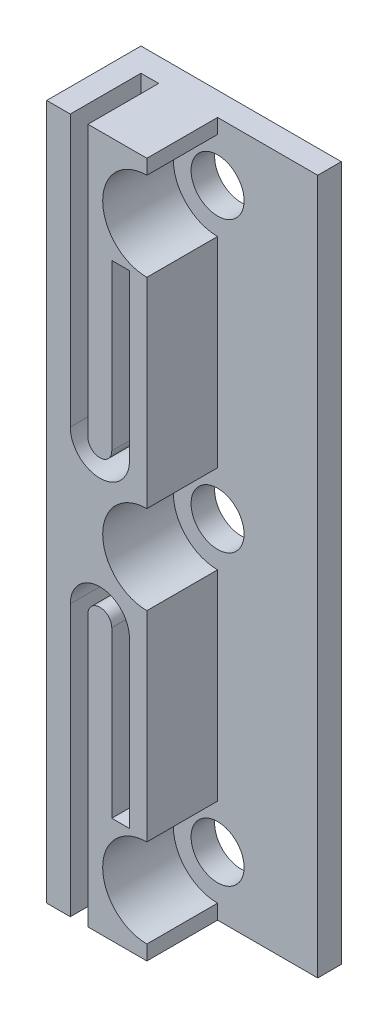
ISO-10303-21;
HEADER;
FILE_DESCRIPTION(('STEP AP214'),'2;1');
FILE_NAME('part.step','',(''),(''),'','','');
FILE_SCHEMA(('AUTOMOTIVE_DESIGN { 1 0 10303 214 1 1 1 1 }'));
ENDSEC;
DATA;
#1=APPLICATION_CONTEXT('core data for automotive mechanical design processes');
#2=APPLICATION_PROTOCOL_DEFINITION('international standard','automotive_design',2000,#1);
#3=PRODUCT_CONTEXT('',#1,'mechanical');
#4=PRODUCT('Part','Part','',(#3));
#5=PRODUCT_RELATED_PRODUCT_CATEGORY('part','',(#4));
#6=PRODUCT_DEFINITION_FORMATION('','',#4);
#7=PRODUCT_DEFINITION_CONTEXT('part definition',#1,'design');
#8=PRODUCT_DEFINITION('design','',#6,#7);
#9=PRODUCT_DEFINITION_SHAPE('','',#8);
#10=(LENGTH_UNIT() NAMED_UNIT(*) SI_UNIT(.MILLI.,.METRE.));
#11=(NAMED_UNIT(*) PLANE_ANGLE_UNIT() SI_UNIT($,.RADIAN.));
#12=(NAMED_UNIT(*) SI_UNIT($,.STERADIAN.) SOLID_ANGLE_UNIT());
#13=UNCERTAINTY_MEASURE_WITH_UNIT(LENGTH_MEASURE(1.E-05),#10,'distance_accuracy_value','');
#14=(GEOMETRIC_REPRESENTATION_CONTEXT(3) GLOBAL_UNCERTAINTY_ASSIGNED_CONTEXT((#13)) GLOBAL_UNIT_ASSIGNED_CONTEXT((#10,
#11,#12)) REPRESENTATION_CONTEXT('',''));
#15=CARTESIAN_POINT('',(0.,0.,0.));
#16=DIRECTION('',(0.,0.,1.));
#17=DIRECTION('',(1.,0.,0.));
#18=AXIS2_PLACEMENT_3D('',#15,#16,#17);
#19=CARTESIAN_POINT('',(8.50000000000001,-5.,-14.));
#20=DIRECTION('',(0.,0.,1.));
#21=DIRECTION('',(1.,0.,0.));
#22=AXIS2_PLACEMENT_3D('',#19,#20,#21);
#23=CYLINDRICAL_SURFACE('',#22,2.25);
#24=CARTESIAN_POINT('',(8.50000000000001,-5.,0.));
#25=DIRECTION('',(0.,0.,1.));
#26=DIRECTION('',(1.,0.,0.));
#27=AXIS2_PLACEMENT_3D('',#24,#25,#26);
#28=CIRCLE('',#27,2.25);
#29=CARTESIAN_POINT('',(10.75,-5.,0.));
#30=VERTEX_POINT('',#29);
#31=EDGE_CURVE('E391',#30,#30,#28,.T.);
#32=ORIENTED_EDGE('',*,*,#31,.F.);
#33=EDGE_LOOP('',(#32));
#34=FACE_BOUND('',#33,.T.);
#35=CARTESIAN_POINT('',(8.50000000000001,-5.,2.));
#36=DIRECTION('',(0.,0.,1.));
#37=DIRECTION('',(1.,0.,0.));
#38=AXIS2_PLACEMENT_3D('',#35,#36,#37);
#39=CIRCLE('',#38,2.25);
#40=CARTESIAN_POINT('',(10.75,-5.,2.));
#41=VERTEX_POINT('',#40);
#42=EDGE_CURVE('E394',#41,#41,#39,.T.);
#43=ORIENTED_EDGE('',*,*,#42,.T.);
#44=EDGE_LOOP('',(#43));
#45=FACE_BOUND('',#44,.T.);
#46=ADVANCED_FACE('F35',(#34,#45),#23,.F.);
#47=CARTESIAN_POINT('',(8.50000000000001,-54.,-14.));
#48=DIRECTION('',(0.,0.,1.));
#49=DIRECTION('',(1.,0.,0.));
#50=AXIS2_PLACEMENT_3D('',#47,#48,#49);
#51=CYLINDRICAL_SURFACE('',#50,2.25);
#52=CARTESIAN_POINT('',(8.50000000000001,-54.,0.));
#53=DIRECTION('',(0.,0.,1.));
#54=DIRECTION('',(1.,0.,0.));
#55=AXIS2_PLACEMENT_3D('',#52,#53,#54);
#56=CIRCLE('',#55,2.25);
#57=CARTESIAN_POINT('',(10.75,-54.,0.));
#58=VERTEX_POINT('',#57);
#59=EDGE_CURVE('E390',#58,#58,#56,.T.);
#60=ORIENTED_EDGE('',*,*,#59,.F.);
#61=EDGE_LOOP('',(#60));
#62=FACE_BOUND('',#61,.T.);
#63=CARTESIAN_POINT('',(8.50000000000001,-54.,2.));
#64=DIRECTION('',(0.,0.,1.));
#65=DIRECTION('',(1.,0.,0.));
#66=AXIS2_PLACEMENT_3D('',#63,#64,#65);
#67=CIRCLE('',#66,2.25);
#68=CARTESIAN_POINT('',(10.75,-54.,2.));
#69=VERTEX_POINT('',#68);
#70=EDGE_CURVE('E387',#69,#69,#67,.T.);
#71=ORIENTED_EDGE('',*,*,#70,.T.);
#72=EDGE_LOOP('',(#71));
#73=FACE_BOUND('',#72,.T.);
#74=ADVANCED_FACE('F474',(#62,#73),#51,.F.);
#75=CARTESIAN_POINT('',(8.5,-29.5,-14.));
#76=DIRECTION('',(0.,0.,1.));
#77=DIRECTION('',(1.,0.,0.));
#78=AXIS2_PLACEMENT_3D('',#75,#76,#77);
#79=CYLINDRICAL_SURFACE('',#78,2.25);
#80=CARTESIAN_POINT('',(8.5,-29.5,0.));
#81=DIRECTION('',(0.,0.,1.));
#82=DIRECTION('',(1.,0.,0.));
#83=AXIS2_PLACEMENT_3D('',#80,#81,#82);
#84=CIRCLE('',#83,2.25);
#85=CARTESIAN_POINT('',(10.75,-29.5,0.));
#86=VERTEX_POINT('',#85);
#87=EDGE_CURVE('E365',#86,#86,#84,.T.);
#88=ORIENTED_EDGE('',*,*,#87,.F.);
#89=EDGE_LOOP('',(#88));
#90=FACE_BOUND('',#89,.T.);
#91=CARTESIAN_POINT('',(8.5,-29.5,2.));
#92=DIRECTION('',(0.,0.,1.));
#93=DIRECTION('',(1.,0.,0.));
#94=AXIS2_PLACEMENT_3D('',#91,#92,#93);
#95=CIRCLE('',#94,2.25);
#96=CARTESIAN_POINT('',(10.75,-29.5,2.));
#97=VERTEX_POINT('',#96);
#98=EDGE_CURVE('E384',#97,#97,#95,.T.);
#99=ORIENTED_EDGE('',*,*,#98,.T.);
#100=EDGE_LOOP('',(#99));
#101=FACE_BOUND('',#100,.T.);
#102=ADVANCED_FACE('F477',(#90,#101),#79,.F.);
#103=CARTESIAN_POINT('',(8.50000000000001,0.,8.));
#104=DIRECTION('',(-1.,0.,0.));
#105=DIRECTION('',(0.,0.,1.));
#106=AXIS2_PLACEMENT_3D('',#103,#104,#105);
#107=PLANE('',#106);
#108=DIRECTION('',(0.,1.,0.));
#109=VECTOR('',#108,1.);
#110=CARTESIAN_POINT('',(8.50000000000001,0.,2.));
#111=LINE('',#110,#109);
#112=CARTESIAN_POINT('',(8.50000000000001,-59.,2.));
#113=VERTEX_POINT('',#112);
#114=CARTESIAN_POINT('',(8.50000000000001,-57.75,2.));
#115=VERTEX_POINT('',#114);
#116=EDGE_CURVE('E267',#113,#115,#111,.T.);
#117=ORIENTED_EDGE('',*,*,#116,.T.);
#118=DIRECTION('',(0.,0.,1.));
#119=VECTOR('',#118,1.);
#120=CARTESIAN_POINT('',(8.50000000000001,-57.75,2.));
#121=LINE('',#120,#119);
#122=CARTESIAN_POINT('',(8.50000000000001,-57.75,8.));
#123=VERTEX_POINT('',#122);
#124=EDGE_CURVE('E231',#115,#123,#121,.T.);
#125=ORIENTED_EDGE('',*,*,#124,.T.);
#126=DIRECTION('',(0.,1.,0.));
#127=VECTOR('',#126,1.);
#128=CARTESIAN_POINT('',(8.50000000000001,0.,8.));
#129=LINE('',#128,#127);
#130=CARTESIAN_POINT('',(8.50000000000001,-59.,8.));
#131=VERTEX_POINT('',#130);
#132=EDGE_CURVE('E242',#131,#123,#129,.T.);
#133=ORIENTED_EDGE('',*,*,#132,.F.);
#134=DIRECTION('',(0.,0.,-1.));
#135=VECTOR('',#134,1.);
#136=CARTESIAN_POINT('',(8.50000000000001,-59.,8.));
#137=LINE('',#136,#135);
#138=EDGE_CURVE('E434',#131,#113,#137,.T.);
#139=ORIENTED_EDGE('',*,*,#138,.T.);
#140=EDGE_LOOP('',(#117,#125,#133,#139));
#141=FACE_BOUND('',#140,.T.);
#142=ADVANCED_FACE('F432',(#141),#107,.F.);
#143=CARTESIAN_POINT('',(8.50000000000001,-25.75,2.));
#144=VERTEX_POINT('',#143);
#145=CARTESIAN_POINT('',(8.50000000000001,-8.75,2.));
#146=VERTEX_POINT('',#145);
#147=EDGE_CURVE('E420',#144,#146,#111,.T.);
#148=ORIENTED_EDGE('',*,*,#147,.T.);
#149=DIRECTION('',(0.,0.,1.));
#150=VECTOR('',#149,1.);
#151=CARTESIAN_POINT('',(8.50000000000001,-8.75,2.));
#152=LINE('',#151,#150);
#153=CARTESIAN_POINT('',(8.50000000000001,-8.75,8.));
#154=VERTEX_POINT('',#153);
#155=EDGE_CURVE('E232',#146,#154,#152,.T.);
#156=ORIENTED_EDGE('',*,*,#155,.T.);
#157=CARTESIAN_POINT('',(8.50000000000001,-25.75,8.));
#158=VERTEX_POINT('',#157);
#159=EDGE_CURVE('E248',#158,#154,#129,.T.);
#160=ORIENTED_EDGE('',*,*,#159,.F.);
#161=DIRECTION('',(0.,0.,1.));
#162=VECTOR('',#161,1.);
#163=CARTESIAN_POINT('',(8.50000000000001,-25.75,2.));
#164=LINE('',#163,#162);
#165=EDGE_CURVE('E397',#158,#144,#164,.F.);
#166=ORIENTED_EDGE('',*,*,#165,.T.);
#167=EDGE_LOOP('',(#148,#156,#160,#166));
#168=FACE_BOUND('',#167,.T.);
#169=ADVANCED_FACE('F424',(#168),#107,.F.);
#170=CARTESIAN_POINT('',(8.50000000000001,-50.25,8.));
#171=VERTEX_POINT('',#170);
#172=CARTESIAN_POINT('',(8.50000000000001,-33.25,8.));
#173=VERTEX_POINT('',#172);
#174=EDGE_CURVE('E239',#171,#173,#129,.T.);
#175=ORIENTED_EDGE('',*,*,#174,.F.);
#176=DIRECTION('',(0.,0.,1.));
#177=VECTOR('',#176,1.);
#178=CARTESIAN_POINT('',(8.50000000000001,-50.25,2.));
#179=LINE('',#178,#177);
#180=CARTESIAN_POINT('',(8.50000000000001,-50.25,2.));
#181=VERTEX_POINT('',#180);
#182=EDGE_CURVE('E221',#171,#181,#179,.F.);
#183=ORIENTED_EDGE('',*,*,#182,.T.);
#184=CARTESIAN_POINT('',(8.50000000000001,-33.25,2.));
#185=VERTEX_POINT('',#184);
#186=EDGE_CURVE('E426',#181,#185,#111,.T.);
#187=ORIENTED_EDGE('',*,*,#186,.T.);
#188=DIRECTION('',(0.,0.,1.));
#189=VECTOR('',#188,1.);
#190=CARTESIAN_POINT('',(8.50000000000001,-33.25,2.));
#191=LINE('',#190,#189);
#192=EDGE_CURVE('E247',#185,#173,#191,.T.);
#193=ORIENTED_EDGE('',*,*,#192,.T.);
#194=EDGE_LOOP('',(#175,#183,#187,#193));
#195=FACE_BOUND('',#194,.T.);
#196=ADVANCED_FACE('F245',(#195),#107,.F.);
#197=CARTESIAN_POINT('',(0.,0.,8.));
#198=DIRECTION('',(0.,0.,1.));
#199=DIRECTION('',(1.,0.,0.));
#200=AXIS2_PLACEMENT_3D('',#197,#198,#199);
#201=PLANE('',#200);
#202=CARTESIAN_POINT('',(8.50000000000001,-5.,8.));
#203=DIRECTION('',(0.,0.,1.));
#204=DIRECTION('',(1.,0.,0.));
#205=AXIS2_PLACEMENT_3D('',#202,#203,#204);
#206=CIRCLE('',#205,3.75);
#207=CARTESIAN_POINT('',(8.50000000000001,-1.25,8.));
#208=VERTEX_POINT('',#207);
#209=EDGE_CURVE('E411',#208,#154,#206,.T.);
#210=ORIENTED_EDGE('',*,*,#209,.F.);
#211=CARTESIAN_POINT('',(8.50000000000001,0.,8.));
#212=VERTEX_POINT('',#211);
#213=EDGE_CURVE('E250',#208,#212,#129,.T.);
#214=ORIENTED_EDGE('',*,*,#213,.T.);
#215=DIRECTION('',(-1.,0.,0.));
#216=VECTOR('',#215,1.);
#217=CARTESIAN_POINT('',(0.,0.,8.));
#218=LINE('',#217,#216);
#219=CARTESIAN_POINT('',(3.50000000000001,0.,8.));
#220=VERTEX_POINT('',#219);
#221=EDGE_CURVE('E593',#212,#220,#218,.T.);
#222=ORIENTED_EDGE('',*,*,#221,.T.);
#223=DIRECTION('',(0.,1.,0.));
#224=VECTOR('',#223,1.);
#225=CARTESIAN_POINT('',(3.50000000000001,0.,8.));
#226=LINE('',#225,#224);
#227=CARTESIAN_POINT('',(3.50000000000001,-23.,8.));
#228=VERTEX_POINT('',#227);
#229=EDGE_CURVE('E357',#228,#220,#226,.T.);
#230=ORIENTED_EDGE('',*,*,#229,.F.);
#231=CARTESIAN_POINT('',(4.5099627510071,-23.,8.));
#232=DIRECTION('',(0.,0.,1.));
#233=DIRECTION('',(1.,0.,0.));
#234=AXIS2_PLACEMENT_3D('',#231,#232,#233);
#235=CIRCLE('',#234,1.00996275100709);
#236=CARTESIAN_POINT('',(5.51992550201419,-23.,8.));
#237=VERTEX_POINT('',#236);
#238=EDGE_CURVE('E359',#228,#237,#235,.T.);
#239=ORIENTED_EDGE('',*,*,#238,.T.);
#240=DIRECTION('',(0.,1.,0.));
#241=VECTOR('',#240,1.);
#242=CARTESIAN_POINT('',(5.51992550201419,0.,8.));
#243=LINE('',#242,#241);
#244=CARTESIAN_POINT('',(5.51992550201419,-9.,8.));
#245=VERTEX_POINT('',#244);
#246=EDGE_CURVE('E362',#237,#245,#243,.T.);
#247=ORIENTED_EDGE('',*,*,#246,.T.);
#248=DIRECTION('',(1.,0.,0.));
#249=VECTOR('',#248,1.);
#250=CARTESIAN_POINT('',(0.,-9.,8.));
#251=LINE('',#250,#249);
#252=CARTESIAN_POINT('',(7.01992550201417,-9.,8.));
#253=VERTEX_POINT('',#252);
#254=EDGE_CURVE('E344',#245,#253,#251,.T.);
#255=ORIENTED_EDGE('',*,*,#254,.T.);
#256=DIRECTION('',(0.,1.,0.));
#257=VECTOR('',#256,1.);
#258=CARTESIAN_POINT('',(7.01992550201417,0.,8.));
#259=LINE('',#258,#257);
#260=CARTESIAN_POINT('',(7.01992550201418,-23.,8.));
#261=VERTEX_POINT('',#260);
#262=EDGE_CURVE('E348',#261,#253,#259,.T.);
#263=ORIENTED_EDGE('',*,*,#262,.F.);
#264=CARTESIAN_POINT('',(4.50996275100709,-23.,8.));
#265=DIRECTION('',(0.,0.,1.));
#266=DIRECTION('',(1.,0.,0.));
#267=AXIS2_PLACEMENT_3D('',#264,#265,#266);
#268=CIRCLE('',#267,2.50996275100709);
#269=CARTESIAN_POINT('',(2.00000000000001,-23.,8.));
#270=VERTEX_POINT('',#269);
#271=EDGE_CURVE('E351',#270,#261,#268,.T.);
#272=ORIENTED_EDGE('',*,*,#271,.F.);
#273=DIRECTION('',(0.,1.,0.));
#274=VECTOR('',#273,1.);
#275=CARTESIAN_POINT('',(2.00000000000001,0.,8.));
#276=LINE('',#275,#274);
#277=CARTESIAN_POINT('',(2.00000000000001,0.,8.));
#278=VERTEX_POINT('',#277);
#279=EDGE_CURVE('E354',#270,#278,#276,.T.);
#280=ORIENTED_EDGE('',*,*,#279,.T.);
#281=CARTESIAN_POINT('',(0.,0.,8.));
#282=VERTEX_POINT('',#281);
#283=EDGE_CURVE('E251',#278,#282,#218,.T.);
#284=ORIENTED_EDGE('',*,*,#283,.T.);
#285=DIRECTION('',(0.,-1.,0.));
#286=VECTOR('',#285,1.);
#287=CARTESIAN_POINT('',(0.,0.,8.));
#288=LINE('',#287,#286);
#289=CARTESIAN_POINT('',(0.,-59.,8.));
#290=VERTEX_POINT('',#289);
#291=EDGE_CURVE('E264',#282,#290,#288,.T.);
#292=ORIENTED_EDGE('',*,*,#291,.T.);
#293=DIRECTION('',(1.,0.,0.));
#294=VECTOR('',#293,1.);
#295=CARTESIAN_POINT('',(0.,-59.,8.));
#296=LINE('',#295,#294);
#297=CARTESIAN_POINT('',(2.00000000000001,-59.,8.));
#298=VERTEX_POINT('',#297);
#299=EDGE_CURVE('E255',#290,#298,#296,.T.);
#300=ORIENTED_EDGE('',*,*,#299,.T.);
#301=DIRECTION('',(0.,1.,0.));
#302=VECTOR('',#301,1.);
#303=CARTESIAN_POINT('',(2.00000000000001,0.,8.));
#304=LINE('',#303,#302);
#305=CARTESIAN_POINT('',(2.00000000000001,-36.,8.));
#306=VERTEX_POINT('',#305);
#307=EDGE_CURVE('E287',#298,#306,#304,.T.);
#308=ORIENTED_EDGE('',*,*,#307,.T.);
#309=CARTESIAN_POINT('',(4.5099627510071,-36.,8.));
#310=DIRECTION('',(0.,0.,1.));
#311=DIRECTION('',(1.,0.,0.));
#312=AXIS2_PLACEMENT_3D('',#309,#310,#311);
#313=CIRCLE('',#312,2.50996275100709);
#314=CARTESIAN_POINT('',(7.01992550201418,-36.,8.));
#315=VERTEX_POINT('',#314);
#316=EDGE_CURVE('E290',#306,#315,#313,.F.);
#317=ORIENTED_EDGE('',*,*,#316,.T.);
#318=DIRECTION('',(0.,1.,0.));
#319=VECTOR('',#318,1.);
#320=CARTESIAN_POINT('',(7.01992550201417,0.,8.));
#321=LINE('',#320,#319);
#322=CARTESIAN_POINT('',(7.01992550201419,-50.,8.));
#323=VERTEX_POINT('',#322);
#324=EDGE_CURVE('E293',#323,#315,#321,.T.);
#325=ORIENTED_EDGE('',*,*,#324,.F.);
#326=DIRECTION('',(1.,0.,0.));
#327=VECTOR('',#326,1.);
#328=CARTESIAN_POINT('',(0.,-50.,8.));
#329=LINE('',#328,#327);
#330=CARTESIAN_POINT('',(5.51992550201419,-50.,8.));
#331=VERTEX_POINT('',#330);
#332=EDGE_CURVE('E296',#331,#323,#329,.T.);
#333=ORIENTED_EDGE('',*,*,#332,.F.);
#334=DIRECTION('',(0.,1.,0.));
#335=VECTOR('',#334,1.);
#336=CARTESIAN_POINT('',(5.51992550201419,0.,8.));
#337=LINE('',#336,#335);
#338=CARTESIAN_POINT('',(5.51992550201419,-36.,8.));
#339=VERTEX_POINT('',#338);
#340=EDGE_CURVE('E299',#331,#339,#337,.T.);
#341=ORIENTED_EDGE('',*,*,#340,.T.);
#342=CARTESIAN_POINT('',(4.5099627510071,-36.,8.));
#343=DIRECTION('',(0.,0.,1.));
#344=DIRECTION('',(1.,0.,0.));
#345=AXIS2_PLACEMENT_3D('',#342,#343,#344);
#346=CIRCLE('',#345,1.00996275100709);
#347=CARTESIAN_POINT('',(3.50000000000001,-36.,8.));
#348=VERTEX_POINT('',#347);
#349=EDGE_CURVE('E302',#348,#339,#346,.F.);
#350=ORIENTED_EDGE('',*,*,#349,.F.);
#351=DIRECTION('',(0.,1.,0.));
#352=VECTOR('',#351,1.);
#353=CARTESIAN_POINT('',(3.50000000000001,0.,8.));
#354=LINE('',#353,#352);
#355=CARTESIAN_POINT('',(3.50000000000001,-59.,8.));
#356=VERTEX_POINT('',#355);
#357=EDGE_CURVE('E58',#356,#348,#354,.T.);
#358=ORIENTED_EDGE('',*,*,#357,.F.);
#359=EDGE_CURVE('E260',#356,#131,#296,.T.);
#360=ORIENTED_EDGE('',*,*,#359,.T.);
#361=ORIENTED_EDGE('',*,*,#132,.T.);
#362=CARTESIAN_POINT('',(8.50000000000001,-54.,8.));
#363=DIRECTION('',(0.,0.,1.));
#364=DIRECTION('',(1.,0.,0.));
#365=AXIS2_PLACEMENT_3D('',#362,#363,#364);
#366=CIRCLE('',#365,3.75);
#367=EDGE_CURVE('E224',#171,#123,#366,.T.);
#368=ORIENTED_EDGE('',*,*,#367,.F.);
#369=ORIENTED_EDGE('',*,*,#174,.T.);
#370=CARTESIAN_POINT('',(8.5,-29.5,8.));
#371=DIRECTION('',(0.,0.,1.));
#372=DIRECTION('',(1.,0.,0.));
#373=AXIS2_PLACEMENT_3D('',#370,#371,#372);
#374=CIRCLE('',#373,3.75);
#375=EDGE_CURVE('E402',#158,#173,#374,.T.);
#376=ORIENTED_EDGE('',*,*,#375,.F.);
#377=ORIENTED_EDGE('',*,*,#159,.T.);
#378=EDGE_LOOP('',(#210,#214,#222,#230,#239,#247,#255,#263,#272,#280,#284,#292,#300,#308,#317,
#325,#333,#341,#350,#358,#360,#361,#368,#369,#376,#377));
#379=FACE_BOUND('',#378,.T.);
#380=ADVANCED_FACE('F237',(#379),#201,.T.);
#381=CARTESIAN_POINT('',(0.,0.,2.));
#382=DIRECTION('',(0.,-1.,0.));
#383=DIRECTION('',(0.,0.,-1.));
#384=AXIS2_PLACEMENT_3D('',#381,#382,#383);
#385=PLANE('',#384);
#386=DIRECTION('',(0.,0.,1.));
#387=VECTOR('',#386,1.);
#388=CARTESIAN_POINT('',(2.00000000000001,0.,2.));
#389=LINE('',#388,#387);
#390=CARTESIAN_POINT('',(2.00000000000001,0.,2.));
#391=VERTEX_POINT('',#390);
#392=EDGE_CURVE('E334',#391,#278,#389,.T.);
#393=ORIENTED_EDGE('',*,*,#392,.F.);
#394=DIRECTION('',(-1.,0.,0.));
#395=VECTOR('',#394,1.);
#396=CARTESIAN_POINT('',(0.,0.,2.));
#397=LINE('',#396,#395);
#398=CARTESIAN_POINT('',(3.50000000000001,0.,2.));
#399=VERTEX_POINT('',#398);
#400=EDGE_CURVE('E375',#399,#391,#397,.T.);
#401=ORIENTED_EDGE('',*,*,#400,.F.);
#402=DIRECTION('',(0.,0.,1.));
#403=VECTOR('',#402,1.);
#404=CARTESIAN_POINT('',(3.50000000000001,0.,2.));
#405=LINE('',#404,#403);
#406=EDGE_CURVE('E331',#399,#220,#405,.T.);
#407=ORIENTED_EDGE('',*,*,#406,.T.);
#408=ORIENTED_EDGE('',*,*,#221,.F.);
#409=DIRECTION('',(0.,0.,-1.));
#410=VECTOR('',#409,1.);
#411=CARTESIAN_POINT('',(8.50000000000001,0.,8.));
#412=LINE('',#411,#410);
#413=CARTESIAN_POINT('',(8.50000000000001,0.,2.));
#414=VERTEX_POINT('',#413);
#415=EDGE_CURVE('E598',#212,#414,#412,.T.);
#416=ORIENTED_EDGE('',*,*,#415,.T.);
#417=DIRECTION('',(-1.,0.,0.));
#418=VECTOR('',#417,1.);
#419=CARTESIAN_POINT('',(0.,0.,2.));
#420=LINE('',#419,#418);
#421=CARTESIAN_POINT('',(17.,0.,2.));
#422=VERTEX_POINT('',#421);
#423=EDGE_CURVE('E447',#422,#414,#420,.T.);
#424=ORIENTED_EDGE('',*,*,#423,.F.);
#425=DIRECTION('',(0.,0.,-1.));
#426=VECTOR('',#425,1.);
#427=CARTESIAN_POINT('',(17.,0.,2.));
#428=LINE('',#427,#426);
#429=CARTESIAN_POINT('',(17.,0.,0.));
#430=VERTEX_POINT('',#429);
#431=EDGE_CURVE('E463',#422,#430,#428,.T.);
#432=ORIENTED_EDGE('',*,*,#431,.T.);
#433=DIRECTION('',(-1.,0.,0.));
#434=VECTOR('',#433,1.);
#435=CARTESIAN_POINT('',(0.,0.,0.));
#436=LINE('',#435,#434);
#437=CARTESIAN_POINT('',(0.,0.,0.));
#438=VERTEX_POINT('',#437);
#439=EDGE_CURVE('E445',#430,#438,#436,.T.);
#440=ORIENTED_EDGE('',*,*,#439,.T.);
#441=DIRECTION('',(0.,0.,-1.));
#442=VECTOR('',#441,1.);
#443=CARTESIAN_POINT('',(0.,0.,2.));
#444=LINE('',#443,#442);
#445=EDGE_CURVE('E454',#282,#438,#444,.T.);
#446=ORIENTED_EDGE('',*,*,#445,.F.);
#447=ORIENTED_EDGE('',*,*,#283,.F.);
#448=EDGE_LOOP('',(#393,#401,#407,#408,#416,#424,#432,#440,#446,#447));
#449=FACE_BOUND('',#448,.T.);
#450=ADVANCED_FACE('F564',(#449),#385,.F.);
#451=CARTESIAN_POINT('',(0.,0.,2.));
#452=DIRECTION('',(1.,0.,0.));
#453=DIRECTION('',(0.,1.,0.));
#454=AXIS2_PLACEMENT_3D('',#451,#452,#453);
#455=PLANE('',#454);
#456=DIRECTION('',(0.,-1.,0.));
#457=VECTOR('',#456,1.);
#458=CARTESIAN_POINT('',(0.,0.,0.));
#459=LINE('',#458,#457);
#460=CARTESIAN_POINT('',(0.,-59.,0.));
#461=VERTEX_POINT('',#460);
#462=EDGE_CURVE('E455',#438,#461,#459,.T.);
#463=ORIENTED_EDGE('',*,*,#462,.T.);
#464=DIRECTION('',(0.,0.,-1.));
#465=VECTOR('',#464,1.);
#466=CARTESIAN_POINT('',(0.,-59.,2.));
#467=LINE('',#466,#465);
#468=EDGE_CURVE('E43',#290,#461,#467,.T.);
#469=ORIENTED_EDGE('',*,*,#468,.F.);
#470=ORIENTED_EDGE('',*,*,#291,.F.);
#471=ORIENTED_EDGE('',*,*,#445,.T.);
#472=EDGE_LOOP('',(#463,#469,#470,#471));
#473=FACE_BOUND('',#472,.T.);
#474=ADVANCED_FACE('F37',(#473),#455,.F.);
#475=CARTESIAN_POINT('',(0.,-59.,2.));
#476=DIRECTION('',(0.,1.,0.));
#477=DIRECTION('',(0.,0.,1.));
#478=AXIS2_PLACEMENT_3D('',#475,#476,#477);
#479=PLANE('',#478);
#480=ORIENTED_EDGE('',*,*,#359,.F.);
#481=DIRECTION('',(0.,0.,1.));
#482=VECTOR('',#481,1.);
#483=CARTESIAN_POINT('',(3.50000000000001,-59.,2.));
#484=LINE('',#483,#482);
#485=CARTESIAN_POINT('',(3.50000000000001,-59.,2.));
#486=VERTEX_POINT('',#485);
#487=EDGE_CURVE('E284',#486,#356,#484,.T.);
#488=ORIENTED_EDGE('',*,*,#487,.F.);
#489=DIRECTION('',(1.,0.,0.));
#490=VECTOR('',#489,1.);
#491=CARTESIAN_POINT('',(0.,-59.,2.));
#492=LINE('',#491,#490);
#493=CARTESIAN_POINT('',(2.00000000000001,-59.,2.));
#494=VERTEX_POINT('',#493);
#495=EDGE_CURVE('E271',#494,#486,#492,.T.);
#496=ORIENTED_EDGE('',*,*,#495,.F.);
#497=DIRECTION('',(0.,0.,1.));
#498=VECTOR('',#497,1.);
#499=CARTESIAN_POINT('',(2.00000000000001,-59.,2.));
#500=LINE('',#499,#498);
#501=EDGE_CURVE('E281',#494,#298,#500,.T.);
#502=ORIENTED_EDGE('',*,*,#501,.T.);
#503=ORIENTED_EDGE('',*,*,#299,.F.);
#504=ORIENTED_EDGE('',*,*,#468,.T.);
#505=DIRECTION('',(1.,0.,0.));
#506=VECTOR('',#505,1.);
#507=CARTESIAN_POINT('',(0.,-59.,0.));
#508=LINE('',#507,#506);
#509=CARTESIAN_POINT('',(17.,-59.,0.));
#510=VERTEX_POINT('',#509);
#511=EDGE_CURVE('E458',#461,#510,#508,.T.);
#512=ORIENTED_EDGE('',*,*,#511,.T.);
#513=DIRECTION('',(0.,0.,-1.));
#514=VECTOR('',#513,1.);
#515=CARTESIAN_POINT('',(17.,-59.,2.));
#516=LINE('',#515,#514);
#517=CARTESIAN_POINT('',(17.,-59.,2.));
#518=VERTEX_POINT('',#517);
#519=EDGE_CURVE('E442',#518,#510,#516,.T.);
#520=ORIENTED_EDGE('',*,*,#519,.F.);
#521=DIRECTION('',(1.,0.,0.));
#522=VECTOR('',#521,1.);
#523=CARTESIAN_POINT('',(0.,-59.,2.));
#524=LINE('',#523,#522);
#525=EDGE_CURVE('E436',#113,#518,#524,.T.);
#526=ORIENTED_EDGE('',*,*,#525,.F.);
#527=ORIENTED_EDGE('',*,*,#138,.F.);
#528=EDGE_LOOP('',(#480,#488,#496,#502,#503,#504,#512,#520,#526,#527));
#529=FACE_BOUND('',#528,.T.);
#530=ADVANCED_FACE('F440',(#529),#479,.F.);
#531=CARTESIAN_POINT('',(17.,0.,2.));
#532=DIRECTION('',(-1.,0.,0.));
#533=DIRECTION('',(0.,-1.,0.));
#534=AXIS2_PLACEMENT_3D('',#531,#532,#533);
#535=PLANE('',#534);
#536=DIRECTION('',(0.,1.,0.));
#537=VECTOR('',#536,1.);
#538=CARTESIAN_POINT('',(17.,0.,0.));
#539=LINE('',#538,#537);
#540=EDGE_CURVE('E449',#510,#430,#539,.T.);
#541=ORIENTED_EDGE('',*,*,#540,.T.);
#542=ORIENTED_EDGE('',*,*,#431,.F.);
#543=DIRECTION('',(0.,1.,0.));
#544=VECTOR('',#543,1.);
#545=CARTESIAN_POINT('',(17.,0.,2.));
#546=LINE('',#545,#544);
#547=EDGE_CURVE('E444',#518,#422,#546,.T.);
#548=ORIENTED_EDGE('',*,*,#547,.F.);
#549=ORIENTED_EDGE('',*,*,#519,.T.);
#550=EDGE_LOOP('',(#541,#542,#548,#549));
#551=FACE_BOUND('',#550,.T.);
#552=ADVANCED_FACE('F483',(#551),#535,.F.);
#553=CARTESIAN_POINT('',(0.,0.,2.));
#554=DIRECTION('',(0.,0.,1.));
#555=DIRECTION('',(1.,0.,0.));
#556=AXIS2_PLACEMENT_3D('',#553,#554,#555);
#557=PLANE('',#556);
#558=ORIENTED_EDGE('',*,*,#70,.F.);
#559=EDGE_LOOP('',(#558));
#560=FACE_BOUND('',#559,.T.);
#561=ORIENTED_EDGE('',*,*,#42,.F.);
#562=EDGE_LOOP('',(#561));
#563=FACE_BOUND('',#562,.T.);
#564=CARTESIAN_POINT('',(8.50000000000001,-1.25,2.));
#565=VERTEX_POINT('',#564);
#566=EDGE_CURVE('E286',#565,#414,#111,.T.);
#567=ORIENTED_EDGE('',*,*,#566,.F.);
#568=CARTESIAN_POINT('',(8.50000000000001,-5.,2.));
#569=DIRECTION('',(0.,0.,1.));
#570=DIRECTION('',(1.,0.,0.));
#571=AXIS2_PLACEMENT_3D('',#568,#569,#570);
#572=CIRCLE('',#571,3.75);
#573=EDGE_CURVE('E408',#565,#146,#572,.T.);
#574=ORIENTED_EDGE('',*,*,#573,.T.);
#575=ORIENTED_EDGE('',*,*,#147,.F.);
#576=CARTESIAN_POINT('',(8.5,-29.5,2.));
#577=DIRECTION('',(0.,0.,1.));
#578=DIRECTION('',(1.,0.,0.));
#579=AXIS2_PLACEMENT_3D('',#576,#577,#578);
#580=CIRCLE('',#579,3.75);
#581=EDGE_CURVE('E401',#144,#185,#580,.T.);
#582=ORIENTED_EDGE('',*,*,#581,.T.);
#583=ORIENTED_EDGE('',*,*,#186,.F.);
#584=CARTESIAN_POINT('',(8.50000000000001,-54.,2.));
#585=DIRECTION('',(0.,0.,1.));
#586=DIRECTION('',(1.,0.,0.));
#587=AXIS2_PLACEMENT_3D('',#584,#585,#586);
#588=CIRCLE('',#587,3.75);
#589=EDGE_CURVE('E227',#181,#115,#588,.T.);
#590=ORIENTED_EDGE('',*,*,#589,.T.);
#591=ORIENTED_EDGE('',*,*,#116,.F.);
#592=ORIENTED_EDGE('',*,*,#525,.T.);
#593=ORIENTED_EDGE('',*,*,#547,.T.);
#594=ORIENTED_EDGE('',*,*,#423,.T.);
#595=EDGE_LOOP('',(#567,#574,#575,#582,#583,#590,#591,#592,#593,#594));
#596=FACE_BOUND('',#595,.T.);
#597=ORIENTED_EDGE('',*,*,#98,.F.);
#598=EDGE_LOOP('',(#597));
#599=FACE_BOUND('',#598,.T.);
#600=ADVANCED_FACE('F418',(#560,#563,#596,#599),#557,.T.);
#601=CARTESIAN_POINT('',(0.,0.,0.));
#602=DIRECTION('',(0.,0.,1.));
#603=DIRECTION('',(1.,0.,0.));
#604=AXIS2_PLACEMENT_3D('',#601,#602,#603);
#605=PLANE('',#604);
#606=ORIENTED_EDGE('',*,*,#59,.T.);
#607=EDGE_LOOP('',(#606));
#608=FACE_BOUND('',#607,.T.);
#609=ORIENTED_EDGE('',*,*,#31,.T.);
#610=EDGE_LOOP('',(#609));
#611=FACE_BOUND('',#610,.T.);
#612=ORIENTED_EDGE('',*,*,#87,.T.);
#613=EDGE_LOOP('',(#612));
#614=FACE_BOUND('',#613,.T.);
#615=ORIENTED_EDGE('',*,*,#462,.F.);
#616=ORIENTED_EDGE('',*,*,#439,.F.);
#617=ORIENTED_EDGE('',*,*,#540,.F.);
#618=ORIENTED_EDGE('',*,*,#511,.F.);
#619=EDGE_LOOP('',(#615,#616,#617,#618));
#620=FACE_BOUND('',#619,.T.);
#621=ADVANCED_FACE('F471',(#608,#611,#614,#620),#605,.F.);
#622=ORIENTED_EDGE('',*,*,#213,.F.);
#623=DIRECTION('',(0.,0.,1.));
#624=VECTOR('',#623,1.);
#625=CARTESIAN_POINT('',(8.50000000000001,-1.25,2.));
#626=LINE('',#625,#624);
#627=EDGE_CURVE('E11',#208,#565,#626,.F.);
#628=ORIENTED_EDGE('',*,*,#627,.T.);
#629=ORIENTED_EDGE('',*,*,#566,.T.);
#630=ORIENTED_EDGE('',*,*,#415,.F.);
#631=EDGE_LOOP('',(#622,#628,#629,#630));
#632=FACE_BOUND('',#631,.T.);
#633=ADVANCED_FACE('F561',(#632),#107,.F.);
#634=CARTESIAN_POINT('',(3.50000000000001,0.,2.));
#635=DIRECTION('',(1.,0.,0.));
#636=DIRECTION('',(0.,0.,-1.));
#637=AXIS2_PLACEMENT_3D('',#634,#635,#636);
#638=PLANE('',#637);
#639=ORIENTED_EDGE('',*,*,#357,.T.);
#640=DIRECTION('',(0.,0.,1.));
#641=VECTOR('',#640,1.);
#642=CARTESIAN_POINT('',(3.50000000000001,-36.,2.));
#643=LINE('',#642,#641);
#644=CARTESIAN_POINT('',(3.50000000000001,-36.,2.));
#645=VERTEX_POINT('',#644);
#646=EDGE_CURVE('E268',#645,#348,#643,.T.);
#647=ORIENTED_EDGE('',*,*,#646,.F.);
#648=DIRECTION('',(0.,1.,0.));
#649=VECTOR('',#648,1.);
#650=CARTESIAN_POINT('',(3.50000000000001,0.,2.));
#651=LINE('',#650,#649);
#652=EDGE_CURVE('E289',#486,#645,#651,.T.);
#653=ORIENTED_EDGE('',*,*,#652,.F.);
#654=ORIENTED_EDGE('',*,*,#487,.T.);
#655=EDGE_LOOP('',(#639,#647,#653,#654));
#656=FACE_BOUND('',#655,.T.);
#657=ADVANCED_FACE('F539',(#656),#638,.F.);
#658=CARTESIAN_POINT('',(2.00000000000001,0.,2.));
#659=DIRECTION('',(1.,0.,0.));
#660=DIRECTION('',(0.,0.,-1.));
#661=AXIS2_PLACEMENT_3D('',#658,#659,#660);
#662=PLANE('',#661);
#663=ORIENTED_EDGE('',*,*,#307,.F.);
#664=ORIENTED_EDGE('',*,*,#501,.F.);
#665=DIRECTION('',(0.,1.,0.));
#666=VECTOR('',#665,1.);
#667=CARTESIAN_POINT('',(2.00000000000001,0.,2.));
#668=LINE('',#667,#666);
#669=CARTESIAN_POINT('',(2.00000000000001,-36.,2.));
#670=VERTEX_POINT('',#669);
#671=EDGE_CURVE('E309',#494,#670,#668,.T.);
#672=ORIENTED_EDGE('',*,*,#671,.T.);
#673=DIRECTION('',(0.,0.,1.));
#674=VECTOR('',#673,1.);
#675=CARTESIAN_POINT('',(2.00000000000001,-36.,2.));
#676=LINE('',#675,#674);
#677=EDGE_CURVE('E279',#670,#306,#676,.T.);
#678=ORIENTED_EDGE('',*,*,#677,.T.);
#679=EDGE_LOOP('',(#663,#664,#672,#678));
#680=FACE_BOUND('',#679,.T.);
#681=ADVANCED_FACE('F535',(#680),#662,.T.);
#682=CARTESIAN_POINT('',(4.5099627510071,-36.,2.));
#683=DIRECTION('',(0.,0.,1.));
#684=DIRECTION('',(1.,0.,0.));
#685=AXIS2_PLACEMENT_3D('',#682,#683,#684);
#686=CYLINDRICAL_SURFACE('',#685,2.50996275100709);
#687=ORIENTED_EDGE('',*,*,#316,.F.);
#688=ORIENTED_EDGE('',*,*,#677,.F.);
#689=CARTESIAN_POINT('',(4.5099627510071,-36.,2.));
#690=DIRECTION('',(0.,0.,1.));
#691=DIRECTION('',(1.,0.,0.));
#692=AXIS2_PLACEMENT_3D('',#689,#690,#691);
#693=CIRCLE('',#692,2.50996275100709);
#694=CARTESIAN_POINT('',(7.01992550201418,-36.,2.));
#695=VERTEX_POINT('',#694);
#696=EDGE_CURVE('E311',#670,#695,#693,.F.);
#697=ORIENTED_EDGE('',*,*,#696,.T.);
#698=DIRECTION('',(0.,0.,1.));
#699=VECTOR('',#698,1.);
#700=CARTESIAN_POINT('',(7.01992550201418,-36.,2.));
#701=LINE('',#700,#699);
#702=EDGE_CURVE('E277',#695,#315,#701,.T.);
#703=ORIENTED_EDGE('',*,*,#702,.T.);
#704=EDGE_LOOP('',(#687,#688,#697,#703));
#705=FACE_BOUND('',#704,.T.);
#706=ADVANCED_FACE('F538',(#705),#686,.F.);
#707=CARTESIAN_POINT('',(7.01992550201417,0.,2.));
#708=DIRECTION('',(1.,0.,0.));
#709=DIRECTION('',(0.,1.,0.));
#710=AXIS2_PLACEMENT_3D('',#707,#708,#709);
#711=PLANE('',#710);
#712=ORIENTED_EDGE('',*,*,#324,.T.);
#713=ORIENTED_EDGE('',*,*,#702,.F.);
#714=DIRECTION('',(0.,1.,0.));
#715=VECTOR('',#714,1.);
#716=CARTESIAN_POINT('',(7.01992550201417,0.,2.));
#717=LINE('',#716,#715);
#718=CARTESIAN_POINT('',(7.01992550201419,-50.,2.));
#719=VERTEX_POINT('',#718);
#720=EDGE_CURVE('E313',#719,#695,#717,.T.);
#721=ORIENTED_EDGE('',*,*,#720,.F.);
#722=DIRECTION('',(0.,0.,1.));
#723=VECTOR('',#722,1.);
#724=CARTESIAN_POINT('',(7.01992550201419,-50.,2.));
#725=LINE('',#724,#723);
#726=EDGE_CURVE('E275',#719,#323,#725,.T.);
#727=ORIENTED_EDGE('',*,*,#726,.T.);
#728=EDGE_LOOP('',(#712,#713,#721,#727));
#729=FACE_BOUND('',#728,.T.);
#730=ADVANCED_FACE('F543',(#729),#711,.F.);
#731=CARTESIAN_POINT('',(0.,-50.,2.));
#732=DIRECTION('',(0.,-1.,0.));
#733=DIRECTION('',(0.,0.,-1.));
#734=AXIS2_PLACEMENT_3D('',#731,#732,#733);
#735=PLANE('',#734);
#736=ORIENTED_EDGE('',*,*,#332,.T.);
#737=ORIENTED_EDGE('',*,*,#726,.F.);
#738=DIRECTION('',(1.,0.,0.));
#739=VECTOR('',#738,1.);
#740=CARTESIAN_POINT('',(0.,-50.,2.));
#741=LINE('',#740,#739);
#742=CARTESIAN_POINT('',(5.51992550201419,-50.,2.));
#743=VERTEX_POINT('',#742);
#744=EDGE_CURVE('E316',#743,#719,#741,.T.);
#745=ORIENTED_EDGE('',*,*,#744,.F.);
#746=DIRECTION('',(0.,0.,1.));
#747=VECTOR('',#746,1.);
#748=CARTESIAN_POINT('',(5.51992550201419,-50.,2.));
#749=LINE('',#748,#747);
#750=EDGE_CURVE('E273',#743,#331,#749,.T.);
#751=ORIENTED_EDGE('',*,*,#750,.T.);
#752=EDGE_LOOP('',(#736,#737,#745,#751));
#753=FACE_BOUND('',#752,.T.);
#754=ADVANCED_FACE('F547',(#753),#735,.F.);
#755=CARTESIAN_POINT('',(5.51992550201419,0.,2.));
#756=DIRECTION('',(1.,0.,0.));
#757=DIRECTION('',(0.,0.,-1.));
#758=AXIS2_PLACEMENT_3D('',#755,#756,#757);
#759=PLANE('',#758);
#760=ORIENTED_EDGE('',*,*,#340,.F.);
#761=ORIENTED_EDGE('',*,*,#750,.F.);
#762=DIRECTION('',(0.,1.,0.));
#763=VECTOR('',#762,1.);
#764=CARTESIAN_POINT('',(5.51992550201419,0.,2.));
#765=LINE('',#764,#763);
#766=CARTESIAN_POINT('',(5.51992550201419,-36.,2.));
#767=VERTEX_POINT('',#766);
#768=EDGE_CURVE('E319',#743,#767,#765,.T.);
#769=ORIENTED_EDGE('',*,*,#768,.T.);
#770=DIRECTION('',(0.,0.,1.));
#771=VECTOR('',#770,1.);
#772=CARTESIAN_POINT('',(5.51992550201419,-36.,2.));
#773=LINE('',#772,#771);
#774=EDGE_CURVE('E270',#767,#339,#773,.T.);
#775=ORIENTED_EDGE('',*,*,#774,.T.);
#776=EDGE_LOOP('',(#760,#761,#769,#775));
#777=FACE_BOUND('',#776,.T.);
#778=ADVANCED_FACE('F551',(#777),#759,.T.);
#779=CARTESIAN_POINT('',(4.5099627510071,-36.,2.));
#780=DIRECTION('',(0.,0.,1.));
#781=DIRECTION('',(1.,0.,0.));
#782=AXIS2_PLACEMENT_3D('',#779,#780,#781);
#783=CYLINDRICAL_SURFACE('',#782,1.00996275100709);
#784=ORIENTED_EDGE('',*,*,#349,.T.);
#785=ORIENTED_EDGE('',*,*,#774,.F.);
#786=CARTESIAN_POINT('',(4.5099627510071,-36.,2.));
#787=DIRECTION('',(0.,0.,1.));
#788=DIRECTION('',(1.,0.,0.));
#789=AXIS2_PLACEMENT_3D('',#786,#787,#788);
#790=CIRCLE('',#789,1.00996275100709);
#791=EDGE_CURVE('E321',#645,#767,#790,.F.);
#792=ORIENTED_EDGE('',*,*,#791,.F.);
#793=ORIENTED_EDGE('',*,*,#646,.T.);
#794=EDGE_LOOP('',(#784,#785,#792,#793));
#795=FACE_BOUND('',#794,.T.);
#796=ADVANCED_FACE('F533',(#795),#783,.T.);
#797=CARTESIAN_POINT('',(0.,0.,2.));
#798=DIRECTION('',(0.,0.,1.));
#799=DIRECTION('',(1.,0.,0.));
#800=AXIS2_PLACEMENT_3D('',#797,#798,#799);
#801=PLANE('',#800);
#802=ORIENTED_EDGE('',*,*,#652,.T.);
#803=ORIENTED_EDGE('',*,*,#791,.T.);
#804=ORIENTED_EDGE('',*,*,#768,.F.);
#805=ORIENTED_EDGE('',*,*,#744,.T.);
#806=ORIENTED_EDGE('',*,*,#720,.T.);
#807=ORIENTED_EDGE('',*,*,#696,.F.);
#808=ORIENTED_EDGE('',*,*,#671,.F.);
#809=ORIENTED_EDGE('',*,*,#495,.T.);
#810=EDGE_LOOP('',(#802,#803,#804,#805,#806,#807,#808,#809));
#811=FACE_BOUND('',#810,.T.);
#812=ADVANCED_FACE('F529',(#811),#801,.T.);
#813=CARTESIAN_POINT('',(5.51992550201419,0.,2.));
#814=DIRECTION('',(1.,0.,0.));
#815=DIRECTION('',(0.,0.,-1.));
#816=AXIS2_PLACEMENT_3D('',#813,#814,#815);
#817=PLANE('',#816);
#818=ORIENTED_EDGE('',*,*,#246,.F.);
#819=DIRECTION('',(0.,0.,1.));
#820=VECTOR('',#819,1.);
#821=CARTESIAN_POINT('',(5.51992550201419,-23.,2.));
#822=LINE('',#821,#820);
#823=CARTESIAN_POINT('',(5.51992550201419,-23.,2.));
#824=VERTEX_POINT('',#823);
#825=EDGE_CURVE('E326',#824,#237,#822,.T.);
#826=ORIENTED_EDGE('',*,*,#825,.F.);
#827=DIRECTION('',(0.,1.,0.));
#828=VECTOR('',#827,1.);
#829=CARTESIAN_POINT('',(5.51992550201419,0.,2.));
#830=LINE('',#829,#828);
#831=CARTESIAN_POINT('',(5.51992550201419,-9.,2.));
#832=VERTEX_POINT('',#831);
#833=EDGE_CURVE('E347',#824,#832,#830,.T.);
#834=ORIENTED_EDGE('',*,*,#833,.T.);
#835=DIRECTION('',(0.,0.,1.));
#836=VECTOR('',#835,1.);
#837=CARTESIAN_POINT('',(5.51992550201419,-9.,2.));
#838=LINE('',#837,#836);
#839=EDGE_CURVE('E306',#832,#245,#838,.T.);
#840=ORIENTED_EDGE('',*,*,#839,.T.);
#841=EDGE_LOOP('',(#818,#826,#834,#840));
#842=FACE_BOUND('',#841,.T.);
#843=ADVANCED_FACE('F507',(#842),#817,.T.);
#844=CARTESIAN_POINT('',(0.,-9.,2.));
#845=DIRECTION('',(0.,-1.,0.));
#846=DIRECTION('',(0.,0.,-1.));
#847=AXIS2_PLACEMENT_3D('',#844,#845,#846);
#848=PLANE('',#847);
#849=ORIENTED_EDGE('',*,*,#254,.F.);
#850=ORIENTED_EDGE('',*,*,#839,.F.);
#851=DIRECTION('',(1.,0.,0.));
#852=VECTOR('',#851,1.);
#853=CARTESIAN_POINT('',(0.,-9.,2.));
#854=LINE('',#853,#852);
#855=CARTESIAN_POINT('',(7.01992550201417,-9.,2.));
#856=VERTEX_POINT('',#855);
#857=EDGE_CURVE('E329',#832,#856,#854,.T.);
#858=ORIENTED_EDGE('',*,*,#857,.T.);
#859=DIRECTION('',(0.,0.,1.));
#860=VECTOR('',#859,1.);
#861=CARTESIAN_POINT('',(7.01992550201417,-9.,2.));
#862=LINE('',#861,#860);
#863=EDGE_CURVE('E340',#856,#253,#862,.T.);
#864=ORIENTED_EDGE('',*,*,#863,.T.);
#865=EDGE_LOOP('',(#849,#850,#858,#864));
#866=FACE_BOUND('',#865,.T.);
#867=ADVANCED_FACE('F503',(#866),#848,.T.);
#868=CARTESIAN_POINT('',(7.01992550201417,0.,2.));
#869=DIRECTION('',(1.,0.,0.));
#870=DIRECTION('',(0.,1.,0.));
#871=AXIS2_PLACEMENT_3D('',#868,#869,#870);
#872=PLANE('',#871);
#873=ORIENTED_EDGE('',*,*,#262,.T.);
#874=ORIENTED_EDGE('',*,*,#863,.F.);
#875=DIRECTION('',(0.,1.,0.));
#876=VECTOR('',#875,1.);
#877=CARTESIAN_POINT('',(7.01992550201417,0.,2.));
#878=LINE('',#877,#876);
#879=CARTESIAN_POINT('',(7.01992550201418,-23.,2.));
#880=VERTEX_POINT('',#879);
#881=EDGE_CURVE('E367',#880,#856,#878,.T.);
#882=ORIENTED_EDGE('',*,*,#881,.F.);
#883=DIRECTION('',(0.,0.,1.));
#884=VECTOR('',#883,1.);
#885=CARTESIAN_POINT('',(7.01992550201418,-23.,2.));
#886=LINE('',#885,#884);
#887=EDGE_CURVE('E338',#880,#261,#886,.T.);
#888=ORIENTED_EDGE('',*,*,#887,.T.);
#889=EDGE_LOOP('',(#873,#874,#882,#888));
#890=FACE_BOUND('',#889,.T.);
#891=ADVANCED_FACE('F506',(#890),#872,.F.);
#892=CARTESIAN_POINT('',(4.50996275100709,-23.,2.));
#893=DIRECTION('',(0.,0.,1.));
#894=DIRECTION('',(1.,0.,0.));
#895=AXIS2_PLACEMENT_3D('',#892,#893,#894);
#896=CYLINDRICAL_SURFACE('',#895,2.50996275100709);
#897=ORIENTED_EDGE('',*,*,#271,.T.);
#898=ORIENTED_EDGE('',*,*,#887,.F.);
#899=CARTESIAN_POINT('',(4.50996275100709,-23.,2.));
#900=DIRECTION('',(0.,0.,1.));
#901=DIRECTION('',(1.,0.,0.));
#902=AXIS2_PLACEMENT_3D('',#899,#900,#901);
#903=CIRCLE('',#902,2.50996275100709);
#904=CARTESIAN_POINT('',(2.00000000000001,-23.,2.));
#905=VERTEX_POINT('',#904);
#906=EDGE_CURVE('E370',#905,#880,#903,.T.);
#907=ORIENTED_EDGE('',*,*,#906,.F.);
#908=DIRECTION('',(0.,0.,1.));
#909=VECTOR('',#908,1.);
#910=CARTESIAN_POINT('',(2.00000000000001,-23.,2.));
#911=LINE('',#910,#909);
#912=EDGE_CURVE('E336',#905,#270,#911,.T.);
#913=ORIENTED_EDGE('',*,*,#912,.T.);
#914=EDGE_LOOP('',(#897,#898,#907,#913));
#915=FACE_BOUND('',#914,.T.);
#916=ADVANCED_FACE('F511',(#915),#896,.F.);
#917=CARTESIAN_POINT('',(2.00000000000001,0.,2.));
#918=DIRECTION('',(1.,0.,0.));
#919=DIRECTION('',(0.,0.,-1.));
#920=AXIS2_PLACEMENT_3D('',#917,#918,#919);
#921=PLANE('',#920);
#922=ORIENTED_EDGE('',*,*,#279,.F.);
#923=ORIENTED_EDGE('',*,*,#912,.F.);
#924=DIRECTION('',(0.,1.,0.));
#925=VECTOR('',#924,1.);
#926=CARTESIAN_POINT('',(2.00000000000001,0.,2.));
#927=LINE('',#926,#925);
#928=EDGE_CURVE('E373',#905,#391,#927,.T.);
#929=ORIENTED_EDGE('',*,*,#928,.T.);
#930=ORIENTED_EDGE('',*,*,#392,.T.);
#931=EDGE_LOOP('',(#922,#923,#929,#930));
#932=FACE_BOUND('',#931,.T.);
#933=ADVANCED_FACE('F515',(#932),#921,.T.);
#934=CARTESIAN_POINT('',(3.50000000000001,0.,2.));
#935=DIRECTION('',(1.,0.,0.));
#936=DIRECTION('',(0.,0.,-1.));
#937=AXIS2_PLACEMENT_3D('',#934,#935,#936);
#938=PLANE('',#937);
#939=ORIENTED_EDGE('',*,*,#229,.T.);
#940=ORIENTED_EDGE('',*,*,#406,.F.);
#941=DIRECTION('',(0.,1.,0.));
#942=VECTOR('',#941,1.);
#943=CARTESIAN_POINT('',(3.50000000000001,0.,2.));
#944=LINE('',#943,#942);
#945=CARTESIAN_POINT('',(3.50000000000001,-23.,2.));
#946=VERTEX_POINT('',#945);
#947=EDGE_CURVE('E50',#946,#399,#944,.T.);
#948=ORIENTED_EDGE('',*,*,#947,.F.);
#949=DIRECTION('',(0.,0.,1.));
#950=VECTOR('',#949,1.);
#951=CARTESIAN_POINT('',(3.50000000000001,-23.,2.));
#952=LINE('',#951,#950);
#953=EDGE_CURVE('E328',#946,#228,#952,.T.);
#954=ORIENTED_EDGE('',*,*,#953,.T.);
#955=EDGE_LOOP('',(#939,#940,#948,#954));
#956=FACE_BOUND('',#955,.T.);
#957=ADVANCED_FACE('F519',(#956),#938,.F.);
#958=CARTESIAN_POINT('',(4.5099627510071,-23.,2.));
#959=DIRECTION('',(0.,0.,1.));
#960=DIRECTION('',(1.,0.,0.));
#961=AXIS2_PLACEMENT_3D('',#958,#959,#960);
#962=CYLINDRICAL_SURFACE('',#961,1.00996275100709);
#963=ORIENTED_EDGE('',*,*,#238,.F.);
#964=ORIENTED_EDGE('',*,*,#953,.F.);
#965=CARTESIAN_POINT('',(4.5099627510071,-23.,2.));
#966=DIRECTION('',(0.,0.,1.));
#967=DIRECTION('',(1.,0.,0.));
#968=AXIS2_PLACEMENT_3D('',#965,#966,#967);
#969=CIRCLE('',#968,1.00996275100709);
#970=EDGE_CURVE('E378',#946,#824,#969,.T.);
#971=ORIENTED_EDGE('',*,*,#970,.T.);
#972=ORIENTED_EDGE('',*,*,#825,.T.);
#973=EDGE_LOOP('',(#963,#964,#971,#972));
#974=FACE_BOUND('',#973,.T.);
#975=ADVANCED_FACE('F502',(#974),#962,.T.);
#976=CARTESIAN_POINT('',(0.,0.,2.));
#977=DIRECTION('',(0.,0.,1.));
#978=DIRECTION('',(1.,0.,0.));
#979=AXIS2_PLACEMENT_3D('',#976,#977,#978);
#980=PLANE('',#979);
#981=ORIENTED_EDGE('',*,*,#833,.F.);
#982=ORIENTED_EDGE('',*,*,#970,.F.);
#983=ORIENTED_EDGE('',*,*,#947,.T.);
#984=ORIENTED_EDGE('',*,*,#400,.T.);
#985=ORIENTED_EDGE('',*,*,#928,.F.);
#986=ORIENTED_EDGE('',*,*,#906,.T.);
#987=ORIENTED_EDGE('',*,*,#881,.T.);
#988=ORIENTED_EDGE('',*,*,#857,.F.);
#989=EDGE_LOOP('',(#981,#982,#983,#984,#985,#986,#987,#988));
#990=FACE_BOUND('',#989,.T.);
#991=ADVANCED_FACE('F498',(#990),#980,.T.);
#992=CARTESIAN_POINT('',(8.5,-29.5,2.));
#993=DIRECTION('',(0.,0.,1.));
#994=DIRECTION('',(1.,0.,0.));
#995=AXIS2_PLACEMENT_3D('',#992,#993,#994);
#996=CYLINDRICAL_SURFACE('',#995,3.75);
#997=ORIENTED_EDGE('',*,*,#375,.T.);
#998=ORIENTED_EDGE('',*,*,#192,.F.);
#999=ORIENTED_EDGE('',*,*,#581,.F.);
#1000=ORIENTED_EDGE('',*,*,#165,.F.);
#1001=EDGE_LOOP('',(#997,#998,#999,#1000));
#1002=FACE_BOUND('',#1001,.T.);
#1003=ADVANCED_FACE('F501',(#1002),#996,.F.);
#1004=CARTESIAN_POINT('',(8.50000000000001,-54.,2.));
#1005=DIRECTION('',(0.,0.,1.));
#1006=DIRECTION('',(1.,0.,0.));
#1007=AXIS2_PLACEMENT_3D('',#1004,#1005,#1006);
#1008=CYLINDRICAL_SURFACE('',#1007,3.75);
#1009=ORIENTED_EDGE('',*,*,#589,.F.);
#1010=ORIENTED_EDGE('',*,*,#182,.F.);
#1011=ORIENTED_EDGE('',*,*,#367,.T.);
#1012=ORIENTED_EDGE('',*,*,#124,.F.);
#1013=EDGE_LOOP('',(#1009,#1010,#1011,#1012));
#1014=FACE_BOUND('',#1013,.T.);
#1015=ADVANCED_FACE('F223',(#1014),#1008,.F.);
#1016=CARTESIAN_POINT('',(8.50000000000001,-5.,2.));
#1017=DIRECTION('',(0.,0.,1.));
#1018=DIRECTION('',(1.,0.,0.));
#1019=AXIS2_PLACEMENT_3D('',#1016,#1017,#1018);
#1020=CYLINDRICAL_SURFACE('',#1019,3.75);
#1021=ORIENTED_EDGE('',*,*,#573,.F.);
#1022=ORIENTED_EDGE('',*,*,#627,.F.);
#1023=ORIENTED_EDGE('',*,*,#209,.T.);
#1024=ORIENTED_EDGE('',*,*,#155,.F.);
#1025=EDGE_LOOP('',(#1021,#1022,#1023,#1024));
#1026=FACE_BOUND('',#1025,.T.);
#1027=ADVANCED_FACE('F611',(#1026),#1020,.F.);
#1028=CLOSED_SHELL('',(#46,#74,#102,#142,#169,#196,#380,#450,#474,#530,#552,#600,#621,#633,#657,
#681,#706,#730,#754,#778,#796,#812,#843,#867,#891,#916,#933,#957,#975,#991,#1003,#1015,#1027));
#1029=MANIFOLD_SOLID_BREP('B2',#1028);
#1030=ADVANCED_BREP_SHAPE_REPRESENTATION('',(#18,#1029),#14);
#1031=SHAPE_DEFINITION_REPRESENTATION(#9,#1030);
ENDSEC;
END-ISO-10303-21;
